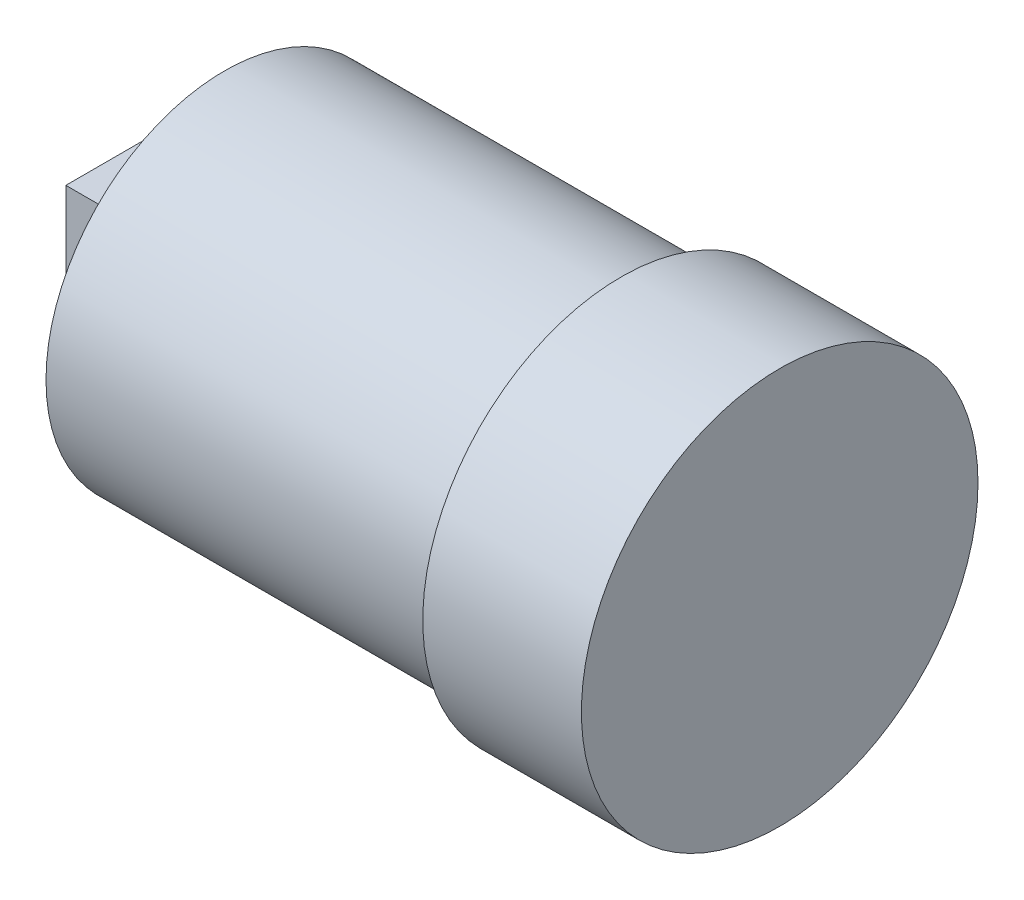
ISO-10303-21;
HEADER;
FILE_DESCRIPTION(('STEP AP214'),'2;1');
FILE_NAME('part.step','',(''),(''),'','','');
FILE_SCHEMA(('AUTOMOTIVE_DESIGN { 1 0 10303 214 1 1 1 1 }'));
ENDSEC;
DATA;
#1=APPLICATION_CONTEXT('core data for automotive mechanical design processes');
#2=APPLICATION_PROTOCOL_DEFINITION('international standard','automotive_design',2000,#1);
#3=PRODUCT_CONTEXT('',#1,'mechanical');
#4=PRODUCT('Part','Part','',(#3));
#5=PRODUCT_RELATED_PRODUCT_CATEGORY('part','',(#4));
#6=PRODUCT_DEFINITION_FORMATION('','',#4);
#7=PRODUCT_DEFINITION_CONTEXT('part definition',#1,'design');
#8=PRODUCT_DEFINITION('design','',#6,#7);
#9=PRODUCT_DEFINITION_SHAPE('','',#8);
#10=(LENGTH_UNIT() NAMED_UNIT(*) SI_UNIT(.MILLI.,.METRE.));
#11=(NAMED_UNIT(*) PLANE_ANGLE_UNIT() SI_UNIT($,.RADIAN.));
#12=(NAMED_UNIT(*) SI_UNIT($,.STERADIAN.) SOLID_ANGLE_UNIT());
#13=UNCERTAINTY_MEASURE_WITH_UNIT(LENGTH_MEASURE(1.E-05),#10,'distance_accuracy_value','');
#14=(GEOMETRIC_REPRESENTATION_CONTEXT(3) GLOBAL_UNCERTAINTY_ASSIGNED_CONTEXT((#13)) GLOBAL_UNIT_ASSIGNED_CONTEXT((#10,
#11,#12)) REPRESENTATION_CONTEXT('',''));
#15=CARTESIAN_POINT('',(0.,0.,0.));
#16=DIRECTION('',(0.,0.,1.));
#17=DIRECTION('',(1.,0.,0.));
#18=AXIS2_PLACEMENT_3D('',#15,#16,#17);
#19=CARTESIAN_POINT('',(0.,0.,0.));
#20=DIRECTION('',(1.,0.,0.));
#21=DIRECTION('',(0.,0.,-1.));
#22=AXIS2_PLACEMENT_3D('',#19,#20,#21);
#23=PLANE('',#22);
#24=CARTESIAN_POINT('',(0.,0.,0.));
#25=DIRECTION('',(1.,0.,0.));
#26=DIRECTION('',(0.,0.,-1.));
#27=AXIS2_PLACEMENT_3D('',#24,#25,#26);
#28=CIRCLE('',#27,22.5);
#29=CARTESIAN_POINT('',(0.,0.,-22.5));
#30=VERTEX_POINT('',#29);
#31=EDGE_CURVE('E11',#30,#30,#28,.F.);
#32=ORIENTED_EDGE('',*,*,#31,.F.);
#33=EDGE_LOOP('',(#32));
#34=FACE_BOUND('',#33,.T.);
#35=CARTESIAN_POINT('',(0.,0.,0.));
#36=DIRECTION('',(1.,0.,0.));
#37=DIRECTION('',(0.,0.,-1.));
#38=AXIS2_PLACEMENT_3D('',#35,#36,#37);
#39=CIRCLE('',#38,25.);
#40=CARTESIAN_POINT('',(0.,0.,-25.));
#41=VERTEX_POINT('',#40);
#42=EDGE_CURVE('E118',#41,#41,#39,.T.);
#43=ORIENTED_EDGE('',*,*,#42,.F.);
#44=EDGE_LOOP('',(#43));
#45=FACE_BOUND('',#44,.T.);
#46=ADVANCED_FACE('F43',(#34,#45),#23,.F.);
#47=CARTESIAN_POINT('',(20.,0.,0.));
#48=DIRECTION('',(-1.,0.,0.));
#49=DIRECTION('',(0.,0.,1.));
#50=AXIS2_PLACEMENT_3D('',#47,#48,#49);
#51=CYLINDRICAL_SURFACE('',#50,25.);
#52=CARTESIAN_POINT('',(20.,0.,0.));
#53=DIRECTION('',(1.,0.,0.));
#54=DIRECTION('',(0.,0.,-1.));
#55=AXIS2_PLACEMENT_3D('',#52,#53,#54);
#56=CIRCLE('',#55,25.);
#57=CARTESIAN_POINT('',(20.,0.,-25.));
#58=VERTEX_POINT('',#57);
#59=EDGE_CURVE('E91',#58,#58,#56,.T.);
#60=ORIENTED_EDGE('',*,*,#59,.F.);
#61=EDGE_LOOP('',(#60));
#62=FACE_BOUND('',#61,.T.);
#63=ORIENTED_EDGE('',*,*,#42,.T.);
#64=EDGE_LOOP('',(#63));
#65=FACE_BOUND('',#64,.T.);
#66=ADVANCED_FACE('F45',(#62,#65),#51,.T.);
#67=CARTESIAN_POINT('',(20.,0.,0.));
#68=DIRECTION('',(1.,0.,0.));
#69=DIRECTION('',(0.,0.,-1.));
#70=AXIS2_PLACEMENT_3D('',#67,#68,#69);
#71=PLANE('',#70);
#72=ORIENTED_EDGE('',*,*,#59,.T.);
#73=EDGE_LOOP('',(#72));
#74=FACE_BOUND('',#73,.T.);
#75=ADVANCED_FACE('F132',(#74),#71,.T.);
#76=CARTESIAN_POINT('',(-50.,0.,0.));
#77=DIRECTION('',(-1.,0.,0.));
#78=DIRECTION('',(0.,0.,1.));
#79=AXIS2_PLACEMENT_3D('',#76,#77,#78);
#80=PLANE('',#79);
#81=CARTESIAN_POINT('',(-50.,0.,0.));
#82=DIRECTION('',(-1.,0.,0.));
#83=DIRECTION('',(0.,0.,1.));
#84=AXIS2_PLACEMENT_3D('',#81,#82,#83);
#85=CIRCLE('',#84,22.5);
#86=CARTESIAN_POINT('',(-50.,0.,22.5));
#87=VERTEX_POINT('',#86);
#88=EDGE_CURVE('E102',#87,#87,#85,.T.);
#89=ORIENTED_EDGE('',*,*,#88,.T.);
#90=EDGE_LOOP('',(#89));
#91=FACE_BOUND('',#90,.T.);
#92=DIRECTION('',(0.,1.,0.));
#93=VECTOR('',#92,1.);
#94=CARTESIAN_POINT('',(-50.,-10.,10.));
#95=LINE('',#94,#93);
#96=CARTESIAN_POINT('',(-50.,-10.,10.));
#97=VERTEX_POINT('',#96);
#98=CARTESIAN_POINT('',(-50.,10.,10.));
#99=VERTEX_POINT('',#98);
#100=EDGE_CURVE('E59',#97,#99,#95,.T.);
#101=ORIENTED_EDGE('',*,*,#100,.F.);
#102=DIRECTION('',(0.,0.,1.));
#103=VECTOR('',#102,1.);
#104=CARTESIAN_POINT('',(-50.,-10.,-10.));
#105=LINE('',#104,#103);
#106=CARTESIAN_POINT('',(-50.,-10.,-10.));
#107=VERTEX_POINT('',#106);
#108=EDGE_CURVE('E52',#107,#97,#105,.T.);
#109=ORIENTED_EDGE('',*,*,#108,.F.);
#110=DIRECTION('',(0.,-1.,0.));
#111=VECTOR('',#110,1.);
#112=CARTESIAN_POINT('',(-50.,-10.,-10.));
#113=LINE('',#112,#111);
#114=CARTESIAN_POINT('',(-50.,10.,-10.));
#115=VERTEX_POINT('',#114);
#116=EDGE_CURVE('E85',#115,#107,#113,.T.);
#117=ORIENTED_EDGE('',*,*,#116,.F.);
#118=DIRECTION('',(0.,0.,-1.));
#119=VECTOR('',#118,1.);
#120=CARTESIAN_POINT('',(-50.,10.,-10.));
#121=LINE('',#120,#119);
#122=EDGE_CURVE('E101',#99,#115,#121,.T.);
#123=ORIENTED_EDGE('',*,*,#122,.F.);
#124=EDGE_LOOP('',(#101,#109,#117,#123));
#125=FACE_BOUND('',#124,.T.);
#126=ADVANCED_FACE('F84',(#91,#125),#80,.T.);
#127=CARTESIAN_POINT('',(-50.,0.,0.));
#128=DIRECTION('',(1.,0.,0.));
#129=DIRECTION('',(0.,0.,-1.));
#130=AXIS2_PLACEMENT_3D('',#127,#128,#129);
#131=CYLINDRICAL_SURFACE('',#130,22.5);
#132=ORIENTED_EDGE('',*,*,#88,.F.);
#133=EDGE_LOOP('',(#132));
#134=FACE_BOUND('',#133,.T.);
#135=ORIENTED_EDGE('',*,*,#31,.T.);
#136=EDGE_LOOP('',(#135));
#137=FACE_BOUND('',#136,.T.);
#138=ADVANCED_FACE('F154',(#134,#137),#131,.T.);
#139=CARTESIAN_POINT('',(-60.,0.,0.));
#140=DIRECTION('',(1.,0.,0.));
#141=DIRECTION('',(0.,0.,-1.));
#142=AXIS2_PLACEMENT_3D('',#139,#140,#141);
#143=PLANE('',#142);
#144=DIRECTION('',(0.,1.,0.));
#145=VECTOR('',#144,1.);
#146=CARTESIAN_POINT('',(-60.,-10.,10.));
#147=LINE('',#146,#145);
#148=CARTESIAN_POINT('',(-60.,-10.,10.));
#149=VERTEX_POINT('',#148);
#150=CARTESIAN_POINT('',(-60.,10.,10.));
#151=VERTEX_POINT('',#150);
#152=EDGE_CURVE('E171',#149,#151,#147,.T.);
#153=ORIENTED_EDGE('',*,*,#152,.T.);
#154=DIRECTION('',(0.,0.,-1.));
#155=VECTOR('',#154,1.);
#156=CARTESIAN_POINT('',(-60.,10.,-10.));
#157=LINE('',#156,#155);
#158=CARTESIAN_POINT('',(-60.,10.,-10.));
#159=VERTEX_POINT('',#158);
#160=EDGE_CURVE('E174',#151,#159,#157,.T.);
#161=ORIENTED_EDGE('',*,*,#160,.T.);
#162=DIRECTION('',(0.,-1.,0.));
#163=VECTOR('',#162,1.);
#164=CARTESIAN_POINT('',(-60.,-10.,-10.));
#165=LINE('',#164,#163);
#166=CARTESIAN_POINT('',(-60.,-10.,-10.));
#167=VERTEX_POINT('',#166);
#168=EDGE_CURVE('E177',#159,#167,#165,.T.);
#169=ORIENTED_EDGE('',*,*,#168,.T.);
#170=DIRECTION('',(0.,0.,1.));
#171=VECTOR('',#170,1.);
#172=CARTESIAN_POINT('',(-60.,-10.,-10.));
#173=LINE('',#172,#171);
#174=EDGE_CURVE('E67',#167,#149,#173,.T.);
#175=ORIENTED_EDGE('',*,*,#174,.T.);
#176=EDGE_LOOP('',(#153,#161,#169,#175));
#177=FACE_BOUND('',#176,.T.);
#178=ADVANCED_FACE('F151',(#177),#143,.F.);
#179=CARTESIAN_POINT('',(-60.,-10.,-10.));
#180=DIRECTION('',(0.,1.,0.));
#181=DIRECTION('',(0.,0.,1.));
#182=AXIS2_PLACEMENT_3D('',#179,#180,#181);
#183=PLANE('',#182);
#184=DIRECTION('',(1.,0.,0.));
#185=VECTOR('',#184,1.);
#186=CARTESIAN_POINT('',(-60.,-10.,-10.));
#187=LINE('',#186,#185);
#188=EDGE_CURVE('E97',#167,#107,#187,.T.);
#189=ORIENTED_EDGE('',*,*,#188,.T.);
#190=ORIENTED_EDGE('',*,*,#108,.T.);
#191=DIRECTION('',(1.,0.,0.));
#192=VECTOR('',#191,1.);
#193=CARTESIAN_POINT('',(-60.,-10.,10.));
#194=LINE('',#193,#192);
#195=EDGE_CURVE('E106',#149,#97,#194,.T.);
#196=ORIENTED_EDGE('',*,*,#195,.F.);
#197=ORIENTED_EDGE('',*,*,#174,.F.);
#198=EDGE_LOOP('',(#189,#190,#196,#197));
#199=FACE_BOUND('',#198,.T.);
#200=ADVANCED_FACE('F104',(#199),#183,.F.);
#201=CARTESIAN_POINT('',(-60.,-10.,-10.));
#202=DIRECTION('',(0.,0.,1.));
#203=DIRECTION('',(1.,0.,0.));
#204=AXIS2_PLACEMENT_3D('',#201,#202,#203);
#205=PLANE('',#204);
#206=DIRECTION('',(1.,0.,0.));
#207=VECTOR('',#206,1.);
#208=CARTESIAN_POINT('',(-60.,10.,-10.));
#209=LINE('',#208,#207);
#210=EDGE_CURVE('E99',#159,#115,#209,.T.);
#211=ORIENTED_EDGE('',*,*,#210,.T.);
#212=ORIENTED_EDGE('',*,*,#116,.T.);
#213=ORIENTED_EDGE('',*,*,#188,.F.);
#214=ORIENTED_EDGE('',*,*,#168,.F.);
#215=EDGE_LOOP('',(#211,#212,#213,#214));
#216=FACE_BOUND('',#215,.T.);
#217=ADVANCED_FACE('F95',(#216),#205,.F.);
#218=CARTESIAN_POINT('',(-60.,10.,-10.));
#219=DIRECTION('',(0.,-1.,0.));
#220=DIRECTION('',(0.,0.,-1.));
#221=AXIS2_PLACEMENT_3D('',#218,#219,#220);
#222=PLANE('',#221);
#223=DIRECTION('',(1.,0.,0.));
#224=VECTOR('',#223,1.);
#225=CARTESIAN_POINT('',(-60.,10.,10.));
#226=LINE('',#225,#224);
#227=EDGE_CURVE('E110',#151,#99,#226,.T.);
#228=ORIENTED_EDGE('',*,*,#227,.T.);
#229=ORIENTED_EDGE('',*,*,#122,.T.);
#230=ORIENTED_EDGE('',*,*,#210,.F.);
#231=ORIENTED_EDGE('',*,*,#160,.F.);
#232=EDGE_LOOP('',(#228,#229,#230,#231));
#233=FACE_BOUND('',#232,.T.);
#234=ADVANCED_FACE('F142',(#233),#222,.F.);
#235=CARTESIAN_POINT('',(-60.,-10.,10.));
#236=DIRECTION('',(0.,0.,-1.));
#237=DIRECTION('',(-1.,0.,0.));
#238=AXIS2_PLACEMENT_3D('',#235,#236,#237);
#239=PLANE('',#238);
#240=ORIENTED_EDGE('',*,*,#195,.T.);
#241=ORIENTED_EDGE('',*,*,#100,.T.);
#242=ORIENTED_EDGE('',*,*,#227,.F.);
#243=ORIENTED_EDGE('',*,*,#152,.F.);
#244=EDGE_LOOP('',(#240,#241,#242,#243));
#245=FACE_BOUND('',#244,.T.);
#246=ADVANCED_FACE('F139',(#245),#239,.F.);
#247=CLOSED_SHELL('',(#46,#66,#75,#126,#138,#178,#200,#217,#234,#246));
#248=MANIFOLD_SOLID_BREP('B2',#247);
#249=ADVANCED_BREP_SHAPE_REPRESENTATION('',(#18,#248),#14);
#250=SHAPE_DEFINITION_REPRESENTATION(#9,#249);
ENDSEC;
END-ISO-10303-21;
